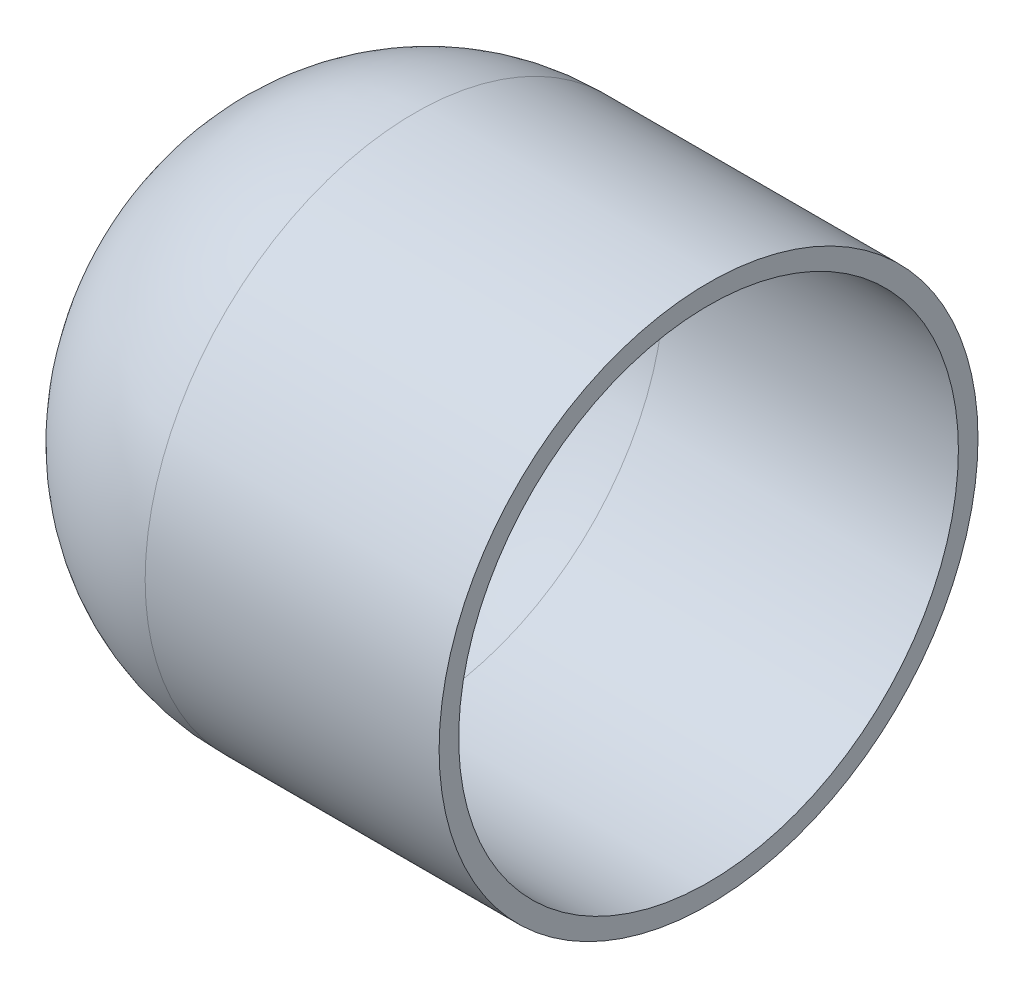
ISO-10303-21;
HEADER;
FILE_DESCRIPTION(('STEP AP214'),'2;1');
FILE_NAME('part.step','',(''),(''),'','','');
FILE_SCHEMA(('AUTOMOTIVE_DESIGN { 1 0 10303 214 1 1 1 1 }'));
ENDSEC;
DATA;
#1=APPLICATION_CONTEXT('core data for automotive mechanical design processes');
#2=APPLICATION_PROTOCOL_DEFINITION('international standard','automotive_design',2000,#1);
#3=PRODUCT_CONTEXT('',#1,'mechanical');
#4=PRODUCT('Part','Part','',(#3));
#5=PRODUCT_RELATED_PRODUCT_CATEGORY('part','',(#4));
#6=PRODUCT_DEFINITION_FORMATION('','',#4);
#7=PRODUCT_DEFINITION_CONTEXT('part definition',#1,'design');
#8=PRODUCT_DEFINITION('design','',#6,#7);
#9=PRODUCT_DEFINITION_SHAPE('','',#8);
#10=(LENGTH_UNIT() NAMED_UNIT(*) SI_UNIT(.MILLI.,.METRE.));
#11=(NAMED_UNIT(*) PLANE_ANGLE_UNIT() SI_UNIT($,.RADIAN.));
#12=(NAMED_UNIT(*) SI_UNIT($,.STERADIAN.) SOLID_ANGLE_UNIT());
#13=UNCERTAINTY_MEASURE_WITH_UNIT(LENGTH_MEASURE(1.E-05),#10,'distance_accuracy_value','');
#14=(GEOMETRIC_REPRESENTATION_CONTEXT(3) GLOBAL_UNCERTAINTY_ASSIGNED_CONTEXT((#13)) GLOBAL_UNIT_ASSIGNED_CONTEXT((#10,
#11,#12)) REPRESENTATION_CONTEXT('',''));
#15=CARTESIAN_POINT('',(0.,0.,0.));
#16=DIRECTION('',(0.,0.,1.));
#17=DIRECTION('',(1.,0.,0.));
#18=AXIS2_PLACEMENT_3D('',#15,#16,#17);
#19=CARTESIAN_POINT('',(0.,0.,0.));
#20=DIRECTION('',(1.,0.,0.));
#21=DIRECTION('',(0.,0.,-1.));
#22=AXIS2_PLACEMENT_3D('',#19,#20,#21);
#23=CYLINDRICAL_SURFACE('',#22,27.5);
#24=CARTESIAN_POINT('',(-30.,0.,0.));
#25=DIRECTION('',(1.,0.,0.));
#26=DIRECTION('',(0.,0.,-1.));
#27=AXIS2_PLACEMENT_3D('',#24,#25,#26);
#28=CIRCLE('',#27,27.5);
#29=CARTESIAN_POINT('',(-30.,0.,-27.5));
#30=VERTEX_POINT('',#29);
#31=EDGE_CURVE('E10',#30,#30,#28,.T.);
#32=ORIENTED_EDGE('',*,*,#31,.T.);
#33=EDGE_LOOP('',(#32));
#34=FACE_BOUND('',#33,.T.);
#35=CARTESIAN_POINT('',(0.,0.,0.));
#36=DIRECTION('',(1.,0.,0.));
#37=DIRECTION('',(0.,0.,-1.));
#38=AXIS2_PLACEMENT_3D('',#35,#36,#37);
#39=CIRCLE('',#38,27.5);
#40=CARTESIAN_POINT('',(0.,0.,-27.5));
#41=VERTEX_POINT('',#40);
#42=EDGE_CURVE('E59',#41,#41,#39,.T.);
#43=ORIENTED_EDGE('',*,*,#42,.F.);
#44=EDGE_LOOP('',(#43));
#45=FACE_BOUND('',#44,.T.);
#46=ADVANCED_FACE('F37',(#34,#45),#23,.T.);
#47=CARTESIAN_POINT('',(-30.1920474974962,0.,0.));
#48=DIRECTION('',(1.,0.,0.));
#49=DIRECTION('',(0.,0.,-1.));
#50=AXIS2_PLACEMENT_3D('',#47,#48,#49);
#51=DEGENERATE_TOROIDAL_SURFACE('',#50,3.50252888443761,23.9982395642586,.T.);
#52=CARTESIAN_POINT('',(-50.8,0.,0.));
#53=DIRECTION('',(1.,0.,0.));
#54=DIRECTION('',(0.,0.,-1.));
#55=AXIS2_PLACEMENT_3D('',#52,#53,#54);
#56=CIRCLE('',#55,15.8);
#57=CARTESIAN_POINT('',(-50.8,0.,-15.8));
#58=VERTEX_POINT('',#57);
#59=EDGE_CURVE('E43',#58,#58,#56,.T.);
#60=ORIENTED_EDGE('',*,*,#59,.T.);
#61=EDGE_LOOP('',(#60));
#62=FACE_BOUND('',#61,.T.);
#63=ORIENTED_EDGE('',*,*,#31,.F.);
#64=EDGE_LOOP('',(#63));
#65=FACE_BOUND('',#64,.T.);
#66=ADVANCED_FACE('F66',(#62,#65),#51,.T.);
#67=CARTESIAN_POINT('',(-50.8,0.,0.));
#68=DIRECTION('',(1.,0.,0.));
#69=DIRECTION('',(0.,0.,-1.));
#70=AXIS2_PLACEMENT_3D('',#67,#68,#69);
#71=PLANE('',#70);
#72=ORIENTED_EDGE('',*,*,#59,.F.);
#73=EDGE_LOOP('',(#72));
#74=FACE_BOUND('',#73,.T.);
#75=CARTESIAN_POINT('',(-50.8,0.,0.));
#76=DIRECTION('',(1.,0.,0.));
#77=DIRECTION('',(0.,0.,-1.));
#78=AXIS2_PLACEMENT_3D('',#75,#76,#77);
#79=CIRCLE('',#78,13.8);
#80=CARTESIAN_POINT('',(-50.8,0.,-13.8));
#81=VERTEX_POINT('',#80);
#82=EDGE_CURVE('E47',#81,#81,#79,.T.);
#83=ORIENTED_EDGE('',*,*,#82,.T.);
#84=EDGE_LOOP('',(#83));
#85=FACE_BOUND('',#84,.T.);
#86=ADVANCED_FACE('F70',(#74,#85),#71,.F.);
#87=CARTESIAN_POINT('',(-30.9762614326441,0.,0.));
#88=DIRECTION('',(1.,0.,0.));
#89=DIRECTION('',(0.,0.,-1.));
#90=AXIS2_PLACEMENT_3D('',#87,#88,#89);
#91=DEGENERATE_TOROIDAL_SURFACE('',#90,2.89668699136724,22.6243860767777,.T.);
#92=CARTESIAN_POINT('',(-30.,0.,0.));
#93=DIRECTION('',(1.,0.,0.));
#94=DIRECTION('',(0.,0.,-1.));
#95=AXIS2_PLACEMENT_3D('',#92,#93,#94);
#96=CIRCLE('',#95,25.5);
#97=CARTESIAN_POINT('',(-30.,0.,-25.5));
#98=VERTEX_POINT('',#97);
#99=EDGE_CURVE('E51',#98,#98,#96,.T.);
#100=ORIENTED_EDGE('',*,*,#99,.T.);
#101=EDGE_LOOP('',(#100));
#102=FACE_BOUND('',#101,.T.);
#103=ORIENTED_EDGE('',*,*,#82,.F.);
#104=EDGE_LOOP('',(#103));
#105=FACE_BOUND('',#104,.T.);
#106=ADVANCED_FACE('F74',(#102,#105),#91,.F.);
#107=CARTESIAN_POINT('',(0.,0.,0.));
#108=DIRECTION('',(1.,0.,0.));
#109=DIRECTION('',(0.,0.,-1.));
#110=AXIS2_PLACEMENT_3D('',#107,#108,#109);
#111=CYLINDRICAL_SURFACE('',#110,25.5);
#112=ORIENTED_EDGE('',*,*,#99,.F.);
#113=EDGE_LOOP('',(#112));
#114=FACE_BOUND('',#113,.T.);
#115=CARTESIAN_POINT('',(0.,0.,0.));
#116=DIRECTION('',(1.,0.,0.));
#117=DIRECTION('',(0.,0.,-1.));
#118=AXIS2_PLACEMENT_3D('',#115,#116,#117);
#119=CIRCLE('',#118,25.5);
#120=CARTESIAN_POINT('',(0.,0.,-25.5));
#121=VERTEX_POINT('',#120);
#122=EDGE_CURVE('E56',#121,#121,#119,.T.);
#123=ORIENTED_EDGE('',*,*,#122,.T.);
#124=EDGE_LOOP('',(#123));
#125=FACE_BOUND('',#124,.T.);
#126=ADVANCED_FACE('F81',(#114,#125),#111,.F.);
#127=CARTESIAN_POINT('',(0.,0.,0.));
#128=DIRECTION('',(-1.,0.,0.));
#129=DIRECTION('',(0.,0.,1.));
#130=AXIS2_PLACEMENT_3D('',#127,#128,#129);
#131=PLANE('',#130);
#132=ORIENTED_EDGE('',*,*,#122,.F.);
#133=EDGE_LOOP('',(#132));
#134=FACE_BOUND('',#133,.T.);
#135=ORIENTED_EDGE('',*,*,#42,.T.);
#136=EDGE_LOOP('',(#135));
#137=FACE_BOUND('',#136,.T.);
#138=ADVANCED_FACE('F63',(#134,#137),#131,.F.);
#139=CLOSED_SHELL('',(#46,#66,#86,#106,#126,#138));
#140=MANIFOLD_SOLID_BREP('B2',#139);
#141=ADVANCED_BREP_SHAPE_REPRESENTATION('',(#18,#140),#14);
#142=SHAPE_DEFINITION_REPRESENTATION(#9,#141);
ENDSEC;
END-ISO-10303-21;
